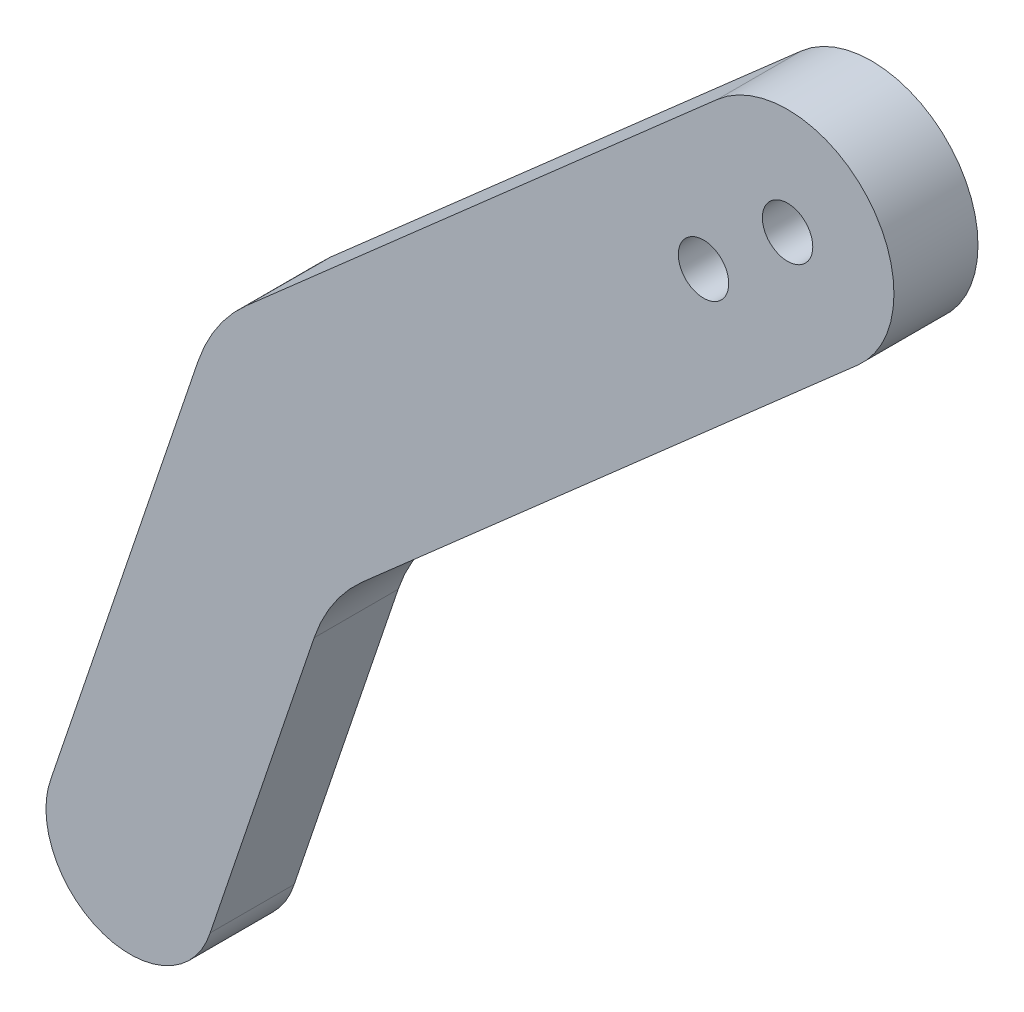
ISO-10303-21;
HEADER;
FILE_DESCRIPTION(('STEP AP214'),'2;1');
FILE_NAME('part.step','',(''),(''),'','','');
FILE_SCHEMA(('AUTOMOTIVE_DESIGN { 1 0 10303 214 1 1 1 1 }'));
ENDSEC;
DATA;
#1=APPLICATION_CONTEXT('core data for automotive mechanical design processes');
#2=APPLICATION_PROTOCOL_DEFINITION('international standard','automotive_design',2000,#1);
#3=PRODUCT_CONTEXT('',#1,'mechanical');
#4=PRODUCT('Part','Part','',(#3));
#5=PRODUCT_RELATED_PRODUCT_CATEGORY('part','',(#4));
#6=PRODUCT_DEFINITION_FORMATION('','',#4);
#7=PRODUCT_DEFINITION_CONTEXT('part definition',#1,'design');
#8=PRODUCT_DEFINITION('design','',#6,#7);
#9=PRODUCT_DEFINITION_SHAPE('','',#8);
#10=(LENGTH_UNIT() NAMED_UNIT(*) SI_UNIT(.MILLI.,.METRE.));
#11=(NAMED_UNIT(*) PLANE_ANGLE_UNIT() SI_UNIT($,.RADIAN.));
#12=(NAMED_UNIT(*) SI_UNIT($,.STERADIAN.) SOLID_ANGLE_UNIT());
#13=UNCERTAINTY_MEASURE_WITH_UNIT(LENGTH_MEASURE(1.E-05),#10,'distance_accuracy_value','');
#14=(GEOMETRIC_REPRESENTATION_CONTEXT(3) GLOBAL_UNCERTAINTY_ASSIGNED_CONTEXT((#13)) GLOBAL_UNIT_ASSIGNED_CONTEXT((#10,
#11,#12)) REPRESENTATION_CONTEXT('',''));
#15=CARTESIAN_POINT('',(0.,0.,0.));
#16=DIRECTION('',(0.,0.,1.));
#17=DIRECTION('',(1.,0.,0.));
#18=AXIS2_PLACEMENT_3D('',#15,#16,#17);
#19=CARTESIAN_POINT('',(9.47332937178148,-3.20250380386071,5.));
#20=DIRECTION('',(-0.947332937178148,0.320250380386071,0.));
#21=DIRECTION('',(-0.320250380386071,-0.947332937178148,0.));
#22=AXIS2_PLACEMENT_3D('',#19,#20,#21);
#23=PLANE('',#22);
#24=DIRECTION('',(0.320250380386071,0.947332937178148,0.));
#25=VECTOR('',#24,1.);
#26=CARTESIAN_POINT('',(9.47332937178148,-3.20250380386071,0.));
#27=LINE('',#26,#25);
#28=CARTESIAN_POINT('',(9.47332937178148,-3.20250380386072,0.));
#29=VERTEX_POINT('',#28);
#30=CARTESIAN_POINT('',(15.660729432273,15.1004498592556,0.));
#31=VERTEX_POINT('',#30);
#32=EDGE_CURVE('E136',#29,#31,#27,.T.);
#33=ORIENTED_EDGE('',*,*,#32,.T.);
#34=DIRECTION('',(0.,0.,-1.));
#35=VECTOR('',#34,1.);
#36=CARTESIAN_POINT('',(15.660729432273,15.1004498592556,5.));
#37=LINE('',#36,#35);
#38=CARTESIAN_POINT('',(15.660729432273,15.1004498592556,5.));
#39=VERTEX_POINT('',#38);
#40=EDGE_CURVE('E11',#39,#31,#37,.T.);
#41=ORIENTED_EDGE('',*,*,#40,.F.);
#42=DIRECTION('',(0.320250380386071,0.947332937178148,0.));
#43=VECTOR('',#42,1.);
#44=CARTESIAN_POINT('',(9.47332937178148,-3.20250380386071,5.));
#45=LINE('',#44,#43);
#46=CARTESIAN_POINT('',(9.47332937178148,-3.20250380386072,5.));
#47=VERTEX_POINT('',#46);
#48=EDGE_CURVE('E155',#47,#39,#45,.T.);
#49=ORIENTED_EDGE('',*,*,#48,.F.);
#50=DIRECTION('',(0.,0.,-1.));
#51=VECTOR('',#50,1.);
#52=CARTESIAN_POINT('',(9.47332937178148,-3.20250380386072,5.));
#53=LINE('',#52,#51);
#54=EDGE_CURVE('E132',#47,#29,#53,.T.);
#55=ORIENTED_EDGE('',*,*,#54,.T.);
#56=EDGE_LOOP('',(#33,#41,#49,#55));
#57=FACE_BOUND('',#56,.T.);
#58=ADVANCED_FACE('F39',(#57),#23,.F.);
#59=CARTESIAN_POINT('',(25.1340588040544,11.8979460553949,5.));
#60=DIRECTION('',(0.,0.,-1.));
#61=DIRECTION('',(-1.,0.,0.));
#62=AXIS2_PLACEMENT_3D('',#59,#60,#61);
#63=CYLINDRICAL_SURFACE('',#62,10.);
#64=CARTESIAN_POINT('',(25.1340588040544,11.8979460553949,0.));
#65=DIRECTION('',(0.,0.,1.));
#66=DIRECTION('',(1.,0.,0.));
#67=AXIS2_PLACEMENT_3D('',#64,#65,#66);
#68=CIRCLE('',#67,10.);
#69=CARTESIAN_POINT('',(18.5311668116048,19.4080603911453,0.));
#70=VERTEX_POINT('',#69);
#71=EDGE_CURVE('E139',#31,#70,#68,.F.);
#72=ORIENTED_EDGE('',*,*,#71,.T.);
#73=DIRECTION('',(0.,0.,-1.));
#74=VECTOR('',#73,1.);
#75=CARTESIAN_POINT('',(18.5311668116048,19.4080603911453,5.));
#76=LINE('',#75,#74);
#77=CARTESIAN_POINT('',(18.5311668116048,19.4080603911453,5.));
#78=VERTEX_POINT('',#77);
#79=EDGE_CURVE('E48',#78,#70,#76,.T.);
#80=ORIENTED_EDGE('',*,*,#79,.F.);
#81=CARTESIAN_POINT('',(25.1340588040544,11.8979460553949,5.));
#82=DIRECTION('',(0.,0.,1.));
#83=DIRECTION('',(1.,0.,0.));
#84=AXIS2_PLACEMENT_3D('',#81,#82,#83);
#85=CIRCLE('',#84,10.);
#86=EDGE_CURVE('E96',#39,#78,#85,.F.);
#87=ORIENTED_EDGE('',*,*,#86,.F.);
#88=ORIENTED_EDGE('',*,*,#40,.T.);
#89=EDGE_LOOP('',(#72,#80,#87,#88));
#90=FACE_BOUND('',#89,.T.);
#91=ADVANCED_FACE('F205',(#90),#63,.F.);
#92=CARTESIAN_POINT('',(-1.54490898778838,1.75717596923991,5.));
#93=DIRECTION('',(-0.660289199244967,0.751011433575042,0.));
#94=DIRECTION('',(-0.751011433575042,-0.660289199244967,0.));
#95=AXIS2_PLACEMENT_3D('',#92,#93,#94);
#96=PLANE('',#95);
#97=DIRECTION('',(0.751011433575042,0.660289199244967,0.));
#98=VECTOR('',#97,1.);
#99=CARTESIAN_POINT('',(-1.54490898778838,1.75717596923991,0.));
#100=LINE('',#99,#98);
#101=CARTESIAN_POINT('',(48.00739775547,45.3235605507574,0.));
#102=VERTEX_POINT('',#101);
#103=EDGE_CURVE('E142',#70,#102,#100,.T.);
#104=ORIENTED_EDGE('',*,*,#103,.T.);
#105=DIRECTION('',(0.,0.,-1.));
#106=VECTOR('',#105,1.);
#107=CARTESIAN_POINT('',(48.00739775547,45.3235605507574,5.));
#108=LINE('',#107,#106);
#109=CARTESIAN_POINT('',(48.00739775547,45.3235605507574,5.));
#110=VERTEX_POINT('',#109);
#111=EDGE_CURVE('E161',#110,#102,#108,.T.);
#112=ORIENTED_EDGE('',*,*,#111,.F.);
#113=DIRECTION('',(0.751011433575042,0.660289199244967,0.));
#114=VECTOR('',#113,1.);
#115=CARTESIAN_POINT('',(-1.54490898778838,1.75717596923991,5.));
#116=LINE('',#115,#114);
#117=EDGE_CURVE('E178',#78,#110,#116,.T.);
#118=ORIENTED_EDGE('',*,*,#117,.F.);
#119=ORIENTED_EDGE('',*,*,#79,.T.);
#120=EDGE_LOOP('',(#104,#112,#118,#119));
#121=FACE_BOUND('',#120,.T.);
#122=ADVANCED_FACE('F209',(#121),#96,.F.);
#123=CARTESIAN_POINT('',(43.8276832550269,50.0775583179502,5.));
#124=DIRECTION('',(0.,0.,-1.));
#125=DIRECTION('',(-1.,0.,0.));
#126=AXIS2_PLACEMENT_3D('',#123,#124,#125);
#127=CYLINDRICAL_SURFACE('',#126,6.33012701892219);
#128=CARTESIAN_POINT('',(43.8276832550269,50.0775583179502,0.));
#129=DIRECTION('',(0.,0.,1.));
#130=DIRECTION('',(1.,0.,0.));
#131=AXIS2_PLACEMENT_3D('',#128,#129,#130);
#132=CIRCLE('',#131,6.33012701892219);
#133=CARTESIAN_POINT('',(39.6479687545838,54.8315560851431,0.));
#134=VERTEX_POINT('',#133);
#135=EDGE_CURVE('E145',#134,#102,#132,.F.);
#136=ORIENTED_EDGE('',*,*,#135,.F.);
#137=DIRECTION('',(0.,0.,-1.));
#138=VECTOR('',#137,1.);
#139=CARTESIAN_POINT('',(39.6479687545838,54.8315560851431,5.));
#140=LINE('',#139,#138);
#141=CARTESIAN_POINT('',(39.6479687545838,54.8315560851431,5.));
#142=VERTEX_POINT('',#141);
#143=EDGE_CURVE('E159',#142,#134,#140,.T.);
#144=ORIENTED_EDGE('',*,*,#143,.F.);
#145=CARTESIAN_POINT('',(43.8276832550269,50.0775583179502,5.));
#146=DIRECTION('',(0.,0.,1.));
#147=DIRECTION('',(1.,0.,0.));
#148=AXIS2_PLACEMENT_3D('',#145,#146,#147);
#149=CIRCLE('',#148,6.33012701892219);
#150=EDGE_CURVE('E180',#142,#110,#149,.F.);
#151=ORIENTED_EDGE('',*,*,#150,.T.);
#152=ORIENTED_EDGE('',*,*,#111,.T.);
#153=EDGE_LOOP('',(#136,#144,#151,#152));
#154=FACE_BOUND('',#153,.T.);
#155=ADVANCED_FACE('F213',(#154),#127,.T.);
#156=CARTESIAN_POINT('',(-9.90433798867452,11.2651715036256,5.));
#157=DIRECTION('',(-0.660289199244967,0.751011433575042,0.));
#158=DIRECTION('',(-0.751011433575042,-0.660289199244967,0.));
#159=AXIS2_PLACEMENT_3D('',#156,#157,#158);
#160=PLANE('',#159);
#161=DIRECTION('',(0.751011433575042,0.660289199244967,0.));
#162=VECTOR('',#161,1.);
#163=CARTESIAN_POINT('',(-9.90433798867452,11.2651715036256,0.));
#164=LINE('',#163,#162);
#165=CARTESIAN_POINT('',(11.6198404829119,30.1892276924312,0.));
#166=VERTEX_POINT('',#165);
#167=EDGE_CURVE('E148',#166,#134,#164,.T.);
#168=ORIENTED_EDGE('',*,*,#167,.F.);
#169=DIRECTION('',(0.,0.,-1.));
#170=VECTOR('',#169,1.);
#171=CARTESIAN_POINT('',(11.6198404829119,30.1892276924312,5.));
#172=LINE('',#171,#170);
#173=CARTESIAN_POINT('',(11.6198404829119,30.1892276924312,5.));
#174=VERTEX_POINT('',#173);
#175=EDGE_CURVE('E121',#174,#166,#172,.T.);
#176=ORIENTED_EDGE('',*,*,#175,.F.);
#177=DIRECTION('',(0.751011433575042,0.660289199244967,0.));
#178=VECTOR('',#177,1.);
#179=CARTESIAN_POINT('',(-9.90433798867452,11.2651715036256,5.));
#180=LINE('',#179,#178);
#181=EDGE_CURVE('E128',#174,#142,#180,.T.);
#182=ORIENTED_EDGE('',*,*,#181,.T.);
#183=ORIENTED_EDGE('',*,*,#143,.T.);
#184=EDGE_LOOP('',(#168,#176,#182,#183));
#185=FACE_BOUND('',#184,.T.);
#186=ADVANCED_FACE('F184',(#185),#160,.T.);
#187=CARTESIAN_POINT('',(18.2227324753615,22.6791133566808,5.));
#188=DIRECTION('',(0.,0.,-1.));
#189=DIRECTION('',(-1.,0.,0.));
#190=AXIS2_PLACEMENT_3D('',#187,#188,#189);
#191=CYLINDRICAL_SURFACE('',#190,10.);
#192=CARTESIAN_POINT('',(18.2227324753615,22.6791133566808,0.));
#193=DIRECTION('',(0.,0.,1.));
#194=DIRECTION('',(1.,0.,0.));
#195=AXIS2_PLACEMENT_3D('',#192,#193,#194);
#196=CIRCLE('',#195,10.);
#197=CARTESIAN_POINT('',(8.74940310358007,25.8816171605416,0.));
#198=VERTEX_POINT('',#197);
#199=EDGE_CURVE('E116',#198,#166,#196,.F.);
#200=ORIENTED_EDGE('',*,*,#199,.F.);
#201=DIRECTION('',(0.,0.,-1.));
#202=VECTOR('',#201,1.);
#203=CARTESIAN_POINT('',(8.74940310358007,25.8816171605416,5.));
#204=LINE('',#203,#202);
#205=CARTESIAN_POINT('',(8.74940310358007,25.8816171605416,5.));
#206=VERTEX_POINT('',#205);
#207=EDGE_CURVE('E111',#206,#198,#204,.T.);
#208=ORIENTED_EDGE('',*,*,#207,.F.);
#209=CARTESIAN_POINT('',(18.2227324753615,22.6791133566808,5.));
#210=DIRECTION('',(0.,0.,1.));
#211=DIRECTION('',(1.,0.,0.));
#212=AXIS2_PLACEMENT_3D('',#209,#210,#211);
#213=CIRCLE('',#212,10.);
#214=EDGE_CURVE('E114',#206,#174,#213,.F.);
#215=ORIENTED_EDGE('',*,*,#214,.T.);
#216=ORIENTED_EDGE('',*,*,#175,.T.);
#217=EDGE_LOOP('',(#200,#208,#215,#216));
#218=FACE_BOUND('',#217,.T.);
#219=ADVANCED_FACE('F113',(#218),#191,.T.);
#220=CARTESIAN_POINT('',(0.,0.,5.));
#221=DIRECTION('',(-0.947332937178148,0.320250380386071,0.));
#222=DIRECTION('',(-0.320250380386071,-0.947332937178148,0.));
#223=AXIS2_PLACEMENT_3D('',#220,#221,#222);
#224=PLANE('',#223);
#225=DIRECTION('',(0.320250380386071,0.947332937178148,0.));
#226=VECTOR('',#225,1.);
#227=CARTESIAN_POINT('',(0.,0.,0.));
#228=LINE('',#227,#226);
#229=CARTESIAN_POINT('',(0.,0.,0.));
#230=VERTEX_POINT('',#229);
#231=EDGE_CURVE('E152',#230,#198,#228,.T.);
#232=ORIENTED_EDGE('',*,*,#231,.F.);
#233=DIRECTION('',(0.,0.,-1.));
#234=VECTOR('',#233,1.);
#235=CARTESIAN_POINT('',(0.,0.,5.));
#236=LINE('',#235,#234);
#237=CARTESIAN_POINT('',(0.,0.,5.));
#238=VERTEX_POINT('',#237);
#239=EDGE_CURVE('E85',#238,#230,#236,.T.);
#240=ORIENTED_EDGE('',*,*,#239,.F.);
#241=DIRECTION('',(0.320250380386071,0.947332937178148,0.));
#242=VECTOR('',#241,1.);
#243=CARTESIAN_POINT('',(0.,0.,5.));
#244=LINE('',#243,#242);
#245=EDGE_CURVE('E125',#238,#206,#244,.T.);
#246=ORIENTED_EDGE('',*,*,#245,.T.);
#247=ORIENTED_EDGE('',*,*,#207,.T.);
#248=EDGE_LOOP('',(#232,#240,#246,#247));
#249=FACE_BOUND('',#248,.T.);
#250=ADVANCED_FACE('F130',(#249),#224,.T.);
#251=CARTESIAN_POINT('',(4.70792350737226,-1.68627120785922,5.));
#252=DIRECTION('',(0.,0.,-1.));
#253=DIRECTION('',(-1.,0.,0.));
#254=AXIS2_PLACEMENT_3D('',#251,#252,#253);
#255=CYLINDRICAL_SURFACE('',#254,5.00080536891042);
#256=CARTESIAN_POINT('',(4.70792350737226,-1.68627120785922,0.));
#257=DIRECTION('',(0.,0.,1.));
#258=DIRECTION('',(1.,0.,0.));
#259=AXIS2_PLACEMENT_3D('',#256,#257,#258);
#260=CIRCLE('',#259,5.00080536891042);
#261=EDGE_CURVE('E88',#230,#29,#260,.T.);
#262=ORIENTED_EDGE('',*,*,#261,.T.);
#263=ORIENTED_EDGE('',*,*,#54,.F.);
#264=CARTESIAN_POINT('',(4.70792350737226,-1.68627120785922,5.));
#265=DIRECTION('',(0.,0.,1.));
#266=DIRECTION('',(1.,0.,0.));
#267=AXIS2_PLACEMENT_3D('',#264,#265,#266);
#268=CIRCLE('',#267,5.00080536891042);
#269=EDGE_CURVE('E57',#238,#47,#268,.T.);
#270=ORIENTED_EDGE('',*,*,#269,.F.);
#271=ORIENTED_EDGE('',*,*,#239,.T.);
#272=EDGE_LOOP('',(#262,#263,#270,#271));
#273=FACE_BOUND('',#272,.T.);
#274=ADVANCED_FACE('F193',(#273),#255,.T.);
#275=CARTESIAN_POINT('',(0.,0.,5.));
#276=DIRECTION('',(0.,0.,1.));
#277=DIRECTION('',(1.,0.,0.));
#278=AXIS2_PLACEMENT_3D('',#275,#276,#277);
#279=PLANE('',#278);
#280=CARTESIAN_POINT('',(38.8276832550269,45.6815586718344,5.));
#281=DIRECTION('',(0.,0.,1.));
#282=DIRECTION('',(1.,0.,0.));
#283=AXIS2_PLACEMENT_3D('',#280,#281,#282);
#284=CIRCLE('',#283,1.5);
#285=CARTESIAN_POINT('',(40.3276832550269,45.6815586718344,5.));
#286=VERTEX_POINT('',#285);
#287=EDGE_CURVE('E173',#286,#286,#284,.T.);
#288=ORIENTED_EDGE('',*,*,#287,.F.);
#289=EDGE_LOOP('',(#288));
#290=FACE_BOUND('',#289,.T.);
#291=CARTESIAN_POINT('',(43.8276832550269,50.0775583179502,5.));
#292=DIRECTION('',(0.,0.,1.));
#293=DIRECTION('',(1.,0.,0.));
#294=AXIS2_PLACEMENT_3D('',#291,#292,#293);
#295=CIRCLE('',#294,1.5);
#296=CARTESIAN_POINT('',(45.3276832550269,50.0775583179502,5.));
#297=VERTEX_POINT('',#296);
#298=EDGE_CURVE('E165',#297,#297,#295,.T.);
#299=ORIENTED_EDGE('',*,*,#298,.F.);
#300=EDGE_LOOP('',(#299));
#301=FACE_BOUND('',#300,.T.);
#302=ORIENTED_EDGE('',*,*,#48,.T.);
#303=ORIENTED_EDGE('',*,*,#86,.T.);
#304=ORIENTED_EDGE('',*,*,#117,.T.);
#305=ORIENTED_EDGE('',*,*,#150,.F.);
#306=ORIENTED_EDGE('',*,*,#181,.F.);
#307=ORIENTED_EDGE('',*,*,#214,.F.);
#308=ORIENTED_EDGE('',*,*,#245,.F.);
#309=ORIENTED_EDGE('',*,*,#269,.T.);
#310=EDGE_LOOP('',(#302,#303,#304,#305,#306,#307,#308,#309));
#311=FACE_BOUND('',#310,.T.);
#312=ADVANCED_FACE('F124',(#290,#301,#311),#279,.T.);
#313=CARTESIAN_POINT('',(0.,0.,0.));
#314=DIRECTION('',(0.,0.,1.));
#315=DIRECTION('',(1.,0.,0.));
#316=AXIS2_PLACEMENT_3D('',#313,#314,#315);
#317=PLANE('',#316);
#318=CARTESIAN_POINT('',(38.8276832550269,45.6815586718344,0.));
#319=DIRECTION('',(0.,0.,1.));
#320=DIRECTION('',(1.,0.,0.));
#321=AXIS2_PLACEMENT_3D('',#318,#319,#320);
#322=CIRCLE('',#321,1.5);
#323=CARTESIAN_POINT('',(40.3276832550269,45.6815586718344,0.));
#324=VERTEX_POINT('',#323);
#325=EDGE_CURVE('E42',#324,#324,#322,.T.);
#326=ORIENTED_EDGE('',*,*,#325,.T.);
#327=EDGE_LOOP('',(#326));
#328=FACE_BOUND('',#327,.T.);
#329=CARTESIAN_POINT('',(43.8276832550269,50.0775583179502,0.));
#330=DIRECTION('',(0.,0.,1.));
#331=DIRECTION('',(1.,0.,0.));
#332=AXIS2_PLACEMENT_3D('',#329,#330,#331);
#333=CIRCLE('',#332,1.5);
#334=CARTESIAN_POINT('',(45.3276832550269,50.0775583179502,0.));
#335=VERTEX_POINT('',#334);
#336=EDGE_CURVE('E140',#335,#335,#333,.T.);
#337=ORIENTED_EDGE('',*,*,#336,.T.);
#338=EDGE_LOOP('',(#337));
#339=FACE_BOUND('',#338,.T.);
#340=ORIENTED_EDGE('',*,*,#32,.F.);
#341=ORIENTED_EDGE('',*,*,#261,.F.);
#342=ORIENTED_EDGE('',*,*,#231,.T.);
#343=ORIENTED_EDGE('',*,*,#199,.T.);
#344=ORIENTED_EDGE('',*,*,#167,.T.);
#345=ORIENTED_EDGE('',*,*,#135,.T.);
#346=ORIENTED_EDGE('',*,*,#103,.F.);
#347=ORIENTED_EDGE('',*,*,#71,.F.);
#348=EDGE_LOOP('',(#340,#341,#342,#343,#344,#345,#346,#347));
#349=FACE_BOUND('',#348,.T.);
#350=ADVANCED_FACE('F188',(#328,#339,#349),#317,.F.);
#351=CARTESIAN_POINT('',(43.8276832550269,50.0775583179502,-2.));
#352=DIRECTION('',(0.,0.,1.));
#353=DIRECTION('',(1.,0.,0.));
#354=AXIS2_PLACEMENT_3D('',#351,#352,#353);
#355=CYLINDRICAL_SURFACE('',#354,1.5);
#356=ORIENTED_EDGE('',*,*,#298,.T.);
#357=EDGE_LOOP('',(#356));
#358=FACE_BOUND('',#357,.T.);
#359=ORIENTED_EDGE('',*,*,#336,.F.);
#360=EDGE_LOOP('',(#359));
#361=FACE_BOUND('',#360,.T.);
#362=ADVANCED_FACE('F250',(#358,#361),#355,.F.);
#363=CARTESIAN_POINT('',(38.8276832550269,45.6815586718344,-2.));
#364=DIRECTION('',(0.,0.,1.));
#365=DIRECTION('',(1.,0.,0.));
#366=AXIS2_PLACEMENT_3D('',#363,#364,#365);
#367=CYLINDRICAL_SURFACE('',#366,1.5);
#368=ORIENTED_EDGE('',*,*,#287,.T.);
#369=EDGE_LOOP('',(#368));
#370=FACE_BOUND('',#369,.T.);
#371=ORIENTED_EDGE('',*,*,#325,.F.);
#372=EDGE_LOOP('',(#371));
#373=FACE_BOUND('',#372,.T.);
#374=ADVANCED_FACE('F259',(#370,#373),#367,.F.);
#375=CLOSED_SHELL('',(#58,#91,#122,#155,#186,#219,#250,#274,#312,#350,#362,#374));
#376=MANIFOLD_SOLID_BREP('B2',#375);
#377=ADVANCED_BREP_SHAPE_REPRESENTATION('',(#18,#376),#14);
#378=SHAPE_DEFINITION_REPRESENTATION(#9,#377);
ENDSEC;
END-ISO-10303-21;
